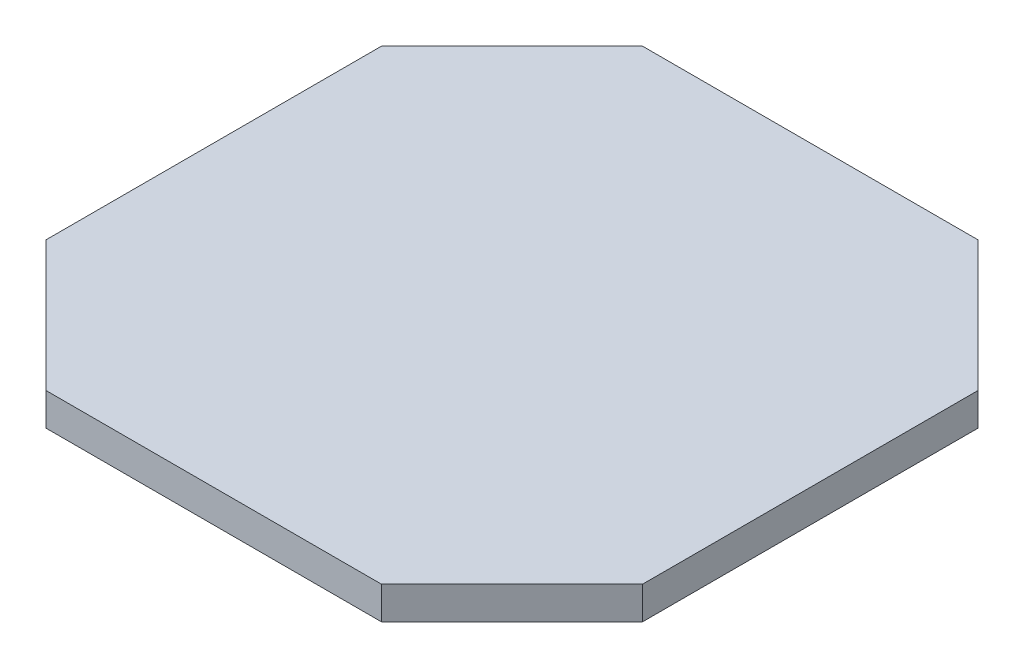
ISO-10303-21;
HEADER;
FILE_DESCRIPTION(('STEP AP214'),'2;1');
FILE_NAME('part.step','',(''),(''),'','','');
FILE_SCHEMA(('AUTOMOTIVE_DESIGN { 1 0 10303 214 1 1 1 1 }'));
ENDSEC;
DATA;
#1=APPLICATION_CONTEXT('core data for automotive mechanical design processes');
#2=APPLICATION_PROTOCOL_DEFINITION('international standard','automotive_design',2000,#1);
#3=PRODUCT_CONTEXT('',#1,'mechanical');
#4=PRODUCT('Part','Part','',(#3));
#5=PRODUCT_RELATED_PRODUCT_CATEGORY('part','',(#4));
#6=PRODUCT_DEFINITION_FORMATION('','',#4);
#7=PRODUCT_DEFINITION_CONTEXT('part definition',#1,'design');
#8=PRODUCT_DEFINITION('design','',#6,#7);
#9=PRODUCT_DEFINITION_SHAPE('','',#8);
#10=(LENGTH_UNIT() NAMED_UNIT(*) SI_UNIT(.MILLI.,.METRE.));
#11=(NAMED_UNIT(*) PLANE_ANGLE_UNIT() SI_UNIT($,.RADIAN.));
#12=(NAMED_UNIT(*) SI_UNIT($,.STERADIAN.) SOLID_ANGLE_UNIT());
#13=UNCERTAINTY_MEASURE_WITH_UNIT(LENGTH_MEASURE(1.E-05),#10,'distance_accuracy_value','');
#14=(GEOMETRIC_REPRESENTATION_CONTEXT(3) GLOBAL_UNCERTAINTY_ASSIGNED_CONTEXT((#13)) GLOBAL_UNIT_ASSIGNED_CONTEXT((#10,
#11,#12)) REPRESENTATION_CONTEXT('',''));
#15=CARTESIAN_POINT('',(0.,0.,0.));
#16=DIRECTION('',(0.,0.,1.));
#17=DIRECTION('',(1.,0.,0.));
#18=AXIS2_PLACEMENT_3D('',#15,#16,#17);
#19=CARTESIAN_POINT('',(16.,-1.75,-16.));
#20=DIRECTION('',(1.,0.,0.));
#21=DIRECTION('',(0.,0.,-1.));
#22=AXIS2_PLACEMENT_3D('',#19,#20,#21);
#23=PLANE('',#22);
#24=DIRECTION('',(0.,0.,-1.));
#25=VECTOR('',#24,1.);
#26=CARTESIAN_POINT('',(16.,-1.75,-16.));
#27=LINE('',#26,#25);
#28=CARTESIAN_POINT('',(16.,-1.75,8.99999999999998));
#29=VERTEX_POINT('',#28);
#30=CARTESIAN_POINT('',(16.,-1.75,-9.00000000000001));
#31=VERTEX_POINT('',#30);
#32=EDGE_CURVE('E166',#29,#31,#27,.T.);
#33=ORIENTED_EDGE('',*,*,#32,.T.);
#34=DIRECTION('',(0.,1.,0.));
#35=VECTOR('',#34,1.);
#36=CARTESIAN_POINT('',(16.,-1.75,-9.00000000000001));
#37=LINE('',#36,#35);
#38=CARTESIAN_POINT('',(16.,0.,-9.00000000000001));
#39=VERTEX_POINT('',#38);
#40=EDGE_CURVE('E121',#31,#39,#37,.T.);
#41=ORIENTED_EDGE('',*,*,#40,.T.);
#42=DIRECTION('',(0.,0.,-1.));
#43=VECTOR('',#42,1.);
#44=CARTESIAN_POINT('',(16.,0.,-16.));
#45=LINE('',#44,#43);
#46=CARTESIAN_POINT('',(16.,0.,8.99999999999998));
#47=VERTEX_POINT('',#46);
#48=EDGE_CURVE('E105',#47,#39,#45,.T.);
#49=ORIENTED_EDGE('',*,*,#48,.F.);
#50=DIRECTION('',(0.,-1.,0.));
#51=VECTOR('',#50,1.);
#52=CARTESIAN_POINT('',(16.,-1.75,8.99999999999998));
#53=LINE('',#52,#51);
#54=EDGE_CURVE('E118',#47,#29,#53,.T.);
#55=ORIENTED_EDGE('',*,*,#54,.T.);
#56=EDGE_LOOP('',(#33,#41,#49,#55));
#57=FACE_BOUND('',#56,.T.);
#58=ADVANCED_FACE('F35',(#57),#23,.T.);
#59=CARTESIAN_POINT('',(-16.,-1.75,16.));
#60=DIRECTION('',(0.,0.,1.));
#61=DIRECTION('',(1.,0.,0.));
#62=AXIS2_PLACEMENT_3D('',#59,#60,#61);
#63=PLANE('',#62);
#64=DIRECTION('',(1.,0.,0.));
#65=VECTOR('',#64,1.);
#66=CARTESIAN_POINT('',(-16.,-1.75,16.));
#67=LINE('',#66,#65);
#68=CARTESIAN_POINT('',(-8.99999999999998,-1.75,16.));
#69=VERTEX_POINT('',#68);
#70=CARTESIAN_POINT('',(9.00000000000001,-1.75,16.));
#71=VERTEX_POINT('',#70);
#72=EDGE_CURVE('E127',#69,#71,#67,.T.);
#73=ORIENTED_EDGE('',*,*,#72,.T.);
#74=DIRECTION('',(0.,1.,0.));
#75=VECTOR('',#74,1.);
#76=CARTESIAN_POINT('',(9.00000000000001,-1.75,16.));
#77=LINE('',#76,#75);
#78=CARTESIAN_POINT('',(9.00000000000001,0.,16.));
#79=VERTEX_POINT('',#78);
#80=EDGE_CURVE('E153',#71,#79,#77,.T.);
#81=ORIENTED_EDGE('',*,*,#80,.T.);
#82=DIRECTION('',(1.,0.,0.));
#83=VECTOR('',#82,1.);
#84=CARTESIAN_POINT('',(-16.,0.,16.));
#85=LINE('',#84,#83);
#86=CARTESIAN_POINT('',(-8.99999999999998,0.,16.));
#87=VERTEX_POINT('',#86);
#88=EDGE_CURVE('E107',#87,#79,#85,.T.);
#89=ORIENTED_EDGE('',*,*,#88,.F.);
#90=DIRECTION('',(0.,-1.,0.));
#91=VECTOR('',#90,1.);
#92=CARTESIAN_POINT('',(-8.99999999999998,-1.75,16.));
#93=LINE('',#92,#91);
#94=EDGE_CURVE('E151',#87,#69,#93,.T.);
#95=ORIENTED_EDGE('',*,*,#94,.T.);
#96=EDGE_LOOP('',(#73,#81,#89,#95));
#97=FACE_BOUND('',#96,.T.);
#98=ADVANCED_FACE('F155',(#97),#63,.T.);
#99=CARTESIAN_POINT('',(-16.,-1.75,-16.));
#100=DIRECTION('',(-1.,0.,0.));
#101=DIRECTION('',(0.,0.,1.));
#102=AXIS2_PLACEMENT_3D('',#99,#100,#101);
#103=PLANE('',#102);
#104=DIRECTION('',(0.,0.,1.));
#105=VECTOR('',#104,1.);
#106=CARTESIAN_POINT('',(-16.,-1.75,-16.));
#107=LINE('',#106,#105);
#108=CARTESIAN_POINT('',(-16.,-1.75,-8.99999999999998));
#109=VERTEX_POINT('',#108);
#110=CARTESIAN_POINT('',(-16.,-1.75,9.00000000000001));
#111=VERTEX_POINT('',#110);
#112=EDGE_CURVE('E132',#109,#111,#107,.T.);
#113=ORIENTED_EDGE('',*,*,#112,.T.);
#114=DIRECTION('',(0.,1.,0.));
#115=VECTOR('',#114,1.);
#116=CARTESIAN_POINT('',(-16.,-1.75,9.00000000000001));
#117=LINE('',#116,#115);
#118=CARTESIAN_POINT('',(-16.,0.,9.00000000000001));
#119=VERTEX_POINT('',#118);
#120=EDGE_CURVE('E11',#111,#119,#117,.T.);
#121=ORIENTED_EDGE('',*,*,#120,.T.);
#122=DIRECTION('',(0.,0.,1.));
#123=VECTOR('',#122,1.);
#124=CARTESIAN_POINT('',(-16.,0.,-16.));
#125=LINE('',#124,#123);
#126=CARTESIAN_POINT('',(-16.,0.,-8.99999999999998));
#127=VERTEX_POINT('',#126);
#128=EDGE_CURVE('E164',#127,#119,#125,.T.);
#129=ORIENTED_EDGE('',*,*,#128,.F.);
#130=DIRECTION('',(0.,-1.,0.));
#131=VECTOR('',#130,1.);
#132=CARTESIAN_POINT('',(-16.,-1.75,-8.99999999999998));
#133=LINE('',#132,#131);
#134=EDGE_CURVE('E44',#127,#109,#133,.T.);
#135=ORIENTED_EDGE('',*,*,#134,.T.);
#136=EDGE_LOOP('',(#113,#121,#129,#135));
#137=FACE_BOUND('',#136,.T.);
#138=ADVANCED_FACE('F163',(#137),#103,.T.);
#139=CARTESIAN_POINT('',(-16.,-1.75,-16.));
#140=DIRECTION('',(0.,0.,-1.));
#141=DIRECTION('',(-1.,0.,0.));
#142=AXIS2_PLACEMENT_3D('',#139,#140,#141);
#143=PLANE('',#142);
#144=DIRECTION('',(-1.,0.,0.));
#145=VECTOR('',#144,1.);
#146=CARTESIAN_POINT('',(-16.,0.,-16.));
#147=LINE('',#146,#145);
#148=CARTESIAN_POINT('',(8.99999999999998,0.,-16.));
#149=VERTEX_POINT('',#148);
#150=CARTESIAN_POINT('',(-9.00000000000001,0.,-16.));
#151=VERTEX_POINT('',#150);
#152=EDGE_CURVE('E122',#149,#151,#147,.T.);
#153=ORIENTED_EDGE('',*,*,#152,.F.);
#154=DIRECTION('',(0.,-1.,0.));
#155=VECTOR('',#154,1.);
#156=CARTESIAN_POINT('',(8.99999999999998,-1.75,-16.));
#157=LINE('',#156,#155);
#158=CARTESIAN_POINT('',(8.99999999999998,-1.75,-16.));
#159=VERTEX_POINT('',#158);
#160=EDGE_CURVE('E143',#149,#159,#157,.T.);
#161=ORIENTED_EDGE('',*,*,#160,.T.);
#162=DIRECTION('',(-1.,0.,0.));
#163=VECTOR('',#162,1.);
#164=CARTESIAN_POINT('',(-16.,-1.75,-16.));
#165=LINE('',#164,#163);
#166=CARTESIAN_POINT('',(-9.00000000000001,-1.75,-16.));
#167=VERTEX_POINT('',#166);
#168=EDGE_CURVE('E170',#159,#167,#165,.T.);
#169=ORIENTED_EDGE('',*,*,#168,.T.);
#170=DIRECTION('',(0.,1.,0.));
#171=VECTOR('',#170,1.);
#172=CARTESIAN_POINT('',(-9.00000000000001,-1.75,-16.));
#173=LINE('',#172,#171);
#174=EDGE_CURVE('E140',#167,#151,#173,.T.);
#175=ORIENTED_EDGE('',*,*,#174,.T.);
#176=EDGE_LOOP('',(#153,#161,#169,#175));
#177=FACE_BOUND('',#176,.T.);
#178=ADVANCED_FACE('F179',(#177),#143,.T.);
#179=CARTESIAN_POINT('',(0.,-1.75,0.));
#180=DIRECTION('',(0.,1.,0.));
#181=DIRECTION('',(0.,0.,1.));
#182=AXIS2_PLACEMENT_3D('',#179,#180,#181);
#183=PLANE('',#182);
#184=ORIENTED_EDGE('',*,*,#168,.F.);
#185=DIRECTION('',(-0.707106781186549,0.,-0.707106781186546));
#186=VECTOR('',#185,1.);
#187=CARTESIAN_POINT('',(16.,-1.75,-9.00000000000001));
#188=LINE('',#187,#186);
#189=EDGE_CURVE('E149',#159,#31,#188,.F.);
#190=ORIENTED_EDGE('',*,*,#189,.T.);
#191=ORIENTED_EDGE('',*,*,#32,.F.);
#192=DIRECTION('',(0.707106781186546,0.,-0.707106781186549));
#193=VECTOR('',#192,1.);
#194=CARTESIAN_POINT('',(9.00000000000001,-1.75,16.));
#195=LINE('',#194,#193);
#196=EDGE_CURVE('E126',#29,#71,#195,.F.);
#197=ORIENTED_EDGE('',*,*,#196,.T.);
#198=ORIENTED_EDGE('',*,*,#72,.F.);
#199=DIRECTION('',(0.707106781186549,0.,0.707106781186546));
#200=VECTOR('',#199,1.);
#201=CARTESIAN_POINT('',(-16.,-1.75,9.00000000000001));
#202=LINE('',#201,#200);
#203=EDGE_CURVE('E51',#69,#111,#202,.F.);
#204=ORIENTED_EDGE('',*,*,#203,.T.);
#205=ORIENTED_EDGE('',*,*,#112,.F.);
#206=DIRECTION('',(-0.707106781186546,0.,0.707106781186549));
#207=VECTOR('',#206,1.);
#208=CARTESIAN_POINT('',(-9.00000000000001,-1.75,-16.));
#209=LINE('',#208,#207);
#210=EDGE_CURVE('E145',#109,#167,#209,.F.);
#211=ORIENTED_EDGE('',*,*,#210,.T.);
#212=EDGE_LOOP('',(#184,#190,#191,#197,#198,#204,#205,#211));
#213=FACE_BOUND('',#212,.T.);
#214=ADVANCED_FACE('F158',(#213),#183,.F.);
#215=CARTESIAN_POINT('',(0.,0.,0.));
#216=DIRECTION('',(0.,1.,0.));
#217=DIRECTION('',(0.,0.,1.));
#218=AXIS2_PLACEMENT_3D('',#215,#216,#217);
#219=PLANE('',#218);
#220=ORIENTED_EDGE('',*,*,#48,.T.);
#221=DIRECTION('',(0.707106781186549,0.,0.707106781186546));
#222=VECTOR('',#221,1.);
#223=CARTESIAN_POINT('',(12.5,0.,-12.5));
#224=LINE('',#223,#222);
#225=EDGE_CURVE('E112',#39,#149,#224,.F.);
#226=ORIENTED_EDGE('',*,*,#225,.T.);
#227=ORIENTED_EDGE('',*,*,#152,.T.);
#228=DIRECTION('',(0.707106781186546,0.,-0.707106781186549));
#229=VECTOR('',#228,1.);
#230=CARTESIAN_POINT('',(-12.5,0.,-12.5));
#231=LINE('',#230,#229);
#232=EDGE_CURVE('E129',#151,#127,#231,.F.);
#233=ORIENTED_EDGE('',*,*,#232,.T.);
#234=ORIENTED_EDGE('',*,*,#128,.T.);
#235=DIRECTION('',(-0.707106781186549,0.,-0.707106781186546));
#236=VECTOR('',#235,1.);
#237=CARTESIAN_POINT('',(-12.5,0.,12.5));
#238=LINE('',#237,#236);
#239=EDGE_CURVE('E113',#119,#87,#238,.F.);
#240=ORIENTED_EDGE('',*,*,#239,.T.);
#241=ORIENTED_EDGE('',*,*,#88,.T.);
#242=DIRECTION('',(-0.707106781186546,0.,0.707106781186549));
#243=VECTOR('',#242,1.);
#244=CARTESIAN_POINT('',(12.5,0.,12.5));
#245=LINE('',#244,#243);
#246=EDGE_CURVE('E102',#79,#47,#245,.F.);
#247=ORIENTED_EDGE('',*,*,#246,.T.);
#248=EDGE_LOOP('',(#220,#226,#227,#233,#234,#240,#241,#247));
#249=FACE_BOUND('',#248,.T.);
#250=ADVANCED_FACE('F104',(#249),#219,.T.);
#251=CARTESIAN_POINT('',(16.,-1.75,-9.00000000000001));
#252=DIRECTION('',(-0.707106781186546,0.,0.707106781186549));
#253=DIRECTION('',(0.,1.,0.));
#254=AXIS2_PLACEMENT_3D('',#251,#252,#253);
#255=PLANE('',#254);
#256=ORIENTED_EDGE('',*,*,#189,.F.);
#257=ORIENTED_EDGE('',*,*,#160,.F.);
#258=ORIENTED_EDGE('',*,*,#225,.F.);
#259=ORIENTED_EDGE('',*,*,#40,.F.);
#260=EDGE_LOOP('',(#256,#257,#258,#259));
#261=FACE_BOUND('',#260,.T.);
#262=ADVANCED_FACE('F175',(#261),#255,.F.);
#263=CARTESIAN_POINT('',(9.00000000000001,-1.75,16.));
#264=DIRECTION('',(-0.707106781186549,0.,-0.707106781186546));
#265=DIRECTION('',(0.,1.,0.));
#266=AXIS2_PLACEMENT_3D('',#263,#264,#265);
#267=PLANE('',#266);
#268=ORIENTED_EDGE('',*,*,#196,.F.);
#269=ORIENTED_EDGE('',*,*,#54,.F.);
#270=ORIENTED_EDGE('',*,*,#246,.F.);
#271=ORIENTED_EDGE('',*,*,#80,.F.);
#272=EDGE_LOOP('',(#268,#269,#270,#271));
#273=FACE_BOUND('',#272,.T.);
#274=ADVANCED_FACE('F125',(#273),#267,.F.);
#275=CARTESIAN_POINT('',(-16.,-1.75,9.00000000000001));
#276=DIRECTION('',(0.707106781186546,0.,-0.707106781186549));
#277=DIRECTION('',(0.,1.,0.));
#278=AXIS2_PLACEMENT_3D('',#275,#276,#277);
#279=PLANE('',#278);
#280=ORIENTED_EDGE('',*,*,#203,.F.);
#281=ORIENTED_EDGE('',*,*,#94,.F.);
#282=ORIENTED_EDGE('',*,*,#239,.F.);
#283=ORIENTED_EDGE('',*,*,#120,.F.);
#284=EDGE_LOOP('',(#280,#281,#282,#283));
#285=FACE_BOUND('',#284,.T.);
#286=ADVANCED_FACE('F161',(#285),#279,.F.);
#287=CARTESIAN_POINT('',(-9.00000000000001,-1.75,-16.));
#288=DIRECTION('',(0.707106781186549,0.,0.707106781186546));
#289=DIRECTION('',(0.,1.,0.));
#290=AXIS2_PLACEMENT_3D('',#287,#288,#289);
#291=PLANE('',#290);
#292=ORIENTED_EDGE('',*,*,#210,.F.);
#293=ORIENTED_EDGE('',*,*,#134,.F.);
#294=ORIENTED_EDGE('',*,*,#232,.F.);
#295=ORIENTED_EDGE('',*,*,#174,.F.);
#296=EDGE_LOOP('',(#292,#293,#294,#295));
#297=FACE_BOUND('',#296,.T.);
#298=ADVANCED_FACE('F38',(#297),#291,.F.);
#299=CLOSED_SHELL('',(#58,#98,#138,#178,#214,#250,#262,#274,#286,#298));
#300=MANIFOLD_SOLID_BREP('B2',#299);
#301=ADVANCED_BREP_SHAPE_REPRESENTATION('',(#18,#300),#14);
#302=SHAPE_DEFINITION_REPRESENTATION(#9,#301);
ENDSEC;
END-ISO-10303-21;
